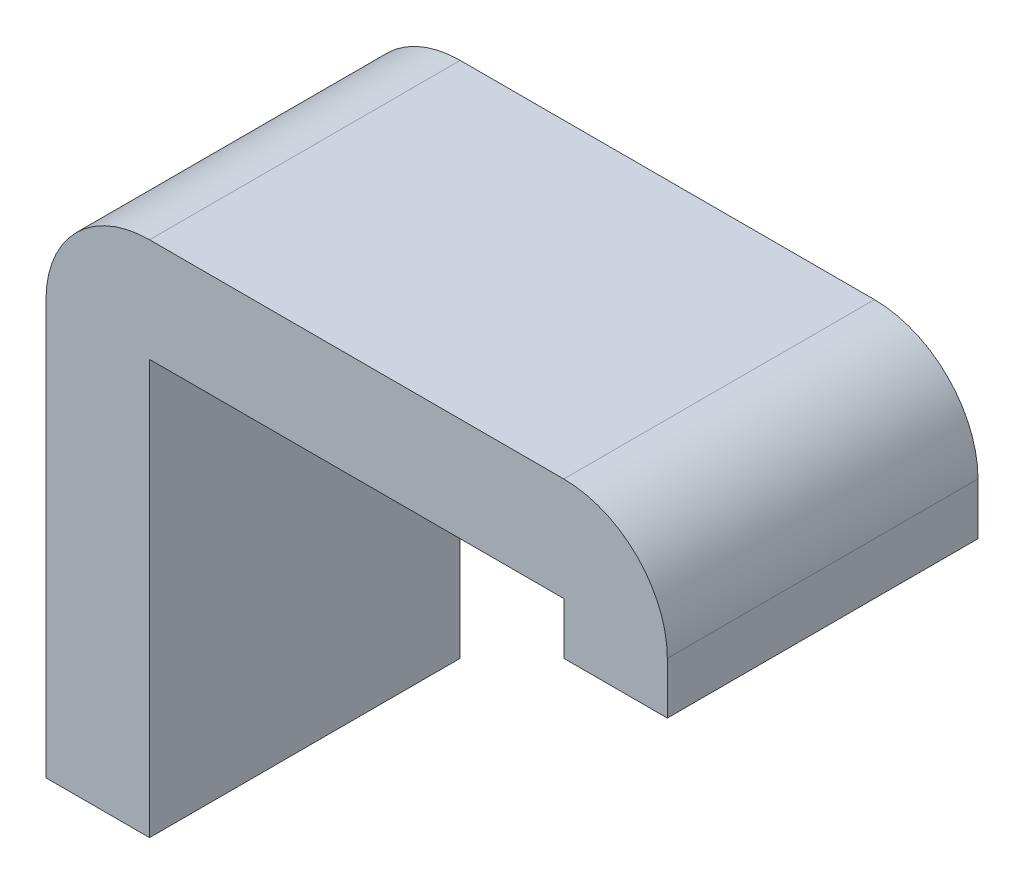
ISO-10303-21;
HEADER;
FILE_DESCRIPTION(('STEP AP214'),'2;1');
FILE_NAME('part.step','',(''),(''),'','','');
FILE_SCHEMA(('AUTOMOTIVE_DESIGN { 1 0 10303 214 1 1 1 1 }'));
ENDSEC;
DATA;
#1=APPLICATION_CONTEXT('core data for automotive mechanical design processes');
#2=APPLICATION_PROTOCOL_DEFINITION('international standard','automotive_design',2000,#1);
#3=PRODUCT_CONTEXT('',#1,'mechanical');
#4=PRODUCT('Part','Part','',(#3));
#5=PRODUCT_RELATED_PRODUCT_CATEGORY('part','',(#4));
#6=PRODUCT_DEFINITION_FORMATION('','',#4);
#7=PRODUCT_DEFINITION_CONTEXT('part definition',#1,'design');
#8=PRODUCT_DEFINITION('design','',#6,#7);
#9=PRODUCT_DEFINITION_SHAPE('','',#8);
#10=(LENGTH_UNIT() NAMED_UNIT(*) SI_UNIT(.MILLI.,.METRE.));
#11=(NAMED_UNIT(*) PLANE_ANGLE_UNIT() SI_UNIT($,.RADIAN.));
#12=(NAMED_UNIT(*) SI_UNIT($,.STERADIAN.) SOLID_ANGLE_UNIT());
#13=UNCERTAINTY_MEASURE_WITH_UNIT(LENGTH_MEASURE(1.E-05),#10,'distance_accuracy_value','');
#14=(GEOMETRIC_REPRESENTATION_CONTEXT(3) GLOBAL_UNCERTAINTY_ASSIGNED_CONTEXT((#13)) GLOBAL_UNIT_ASSIGNED_CONTEXT((#10,
#11,#12)) REPRESENTATION_CONTEXT('',''));
#15=CARTESIAN_POINT('',(0.,0.,0.));
#16=DIRECTION('',(0.,0.,1.));
#17=DIRECTION('',(1.,0.,0.));
#18=AXIS2_PLACEMENT_3D('',#15,#16,#17);
#19=CARTESIAN_POINT('',(20.,-10.0000000000001,30.));
#20=DIRECTION('',(1.,0.,0.));
#21=DIRECTION('',(0.,0.,-1.));
#22=AXIS2_PLACEMENT_3D('',#19,#20,#21);
#23=PLANE('',#22);
#24=DIRECTION('',(0.,1.,0.));
#25=VECTOR('',#24,1.);
#26=CARTESIAN_POINT('',(20.,-10.0000000000001,0.));
#27=LINE('',#26,#25);
#28=CARTESIAN_POINT('',(20.,-9.99999999999999,0.));
#29=VERTEX_POINT('',#28);
#30=CARTESIAN_POINT('',(20.,-15.,0.));
#31=VERTEX_POINT('',#30);
#32=EDGE_CURVE('E225',#29,#31,#27,.F.);
#33=ORIENTED_EDGE('',*,*,#32,.T.);
#34=DIRECTION('',(0.,0.,-1.));
#35=VECTOR('',#34,1.);
#36=CARTESIAN_POINT('',(20.,-15.,30.));
#37=LINE('',#36,#35);
#38=CARTESIAN_POINT('',(20.,-15.,30.));
#39=VERTEX_POINT('',#38);
#40=EDGE_CURVE('E11',#39,#31,#37,.T.);
#41=ORIENTED_EDGE('',*,*,#40,.F.);
#42=DIRECTION('',(0.,1.,0.));
#43=VECTOR('',#42,1.);
#44=CARTESIAN_POINT('',(20.,-10.0000000000001,30.));
#45=LINE('',#44,#43);
#46=CARTESIAN_POINT('',(20.,-9.99999999999999,30.));
#47=VERTEX_POINT('',#46);
#48=EDGE_CURVE('E231',#47,#39,#45,.F.);
#49=ORIENTED_EDGE('',*,*,#48,.F.);
#50=DIRECTION('',(0.,0.,-1.));
#51=VECTOR('',#50,1.);
#52=CARTESIAN_POINT('',(20.,-9.99999999999999,30.));
#53=LINE('',#52,#51);
#54=EDGE_CURVE('E259',#47,#29,#53,.T.);
#55=ORIENTED_EDGE('',*,*,#54,.T.);
#56=EDGE_LOOP('',(#33,#41,#49,#55));
#57=FACE_BOUND('',#56,.T.);
#58=ADVANCED_FACE('F39',(#57),#23,.F.);
#59=CARTESIAN_POINT('',(30.,-15.,30.));
#60=DIRECTION('',(0.,-1.,0.));
#61=DIRECTION('',(0.,0.,-1.));
#62=AXIS2_PLACEMENT_3D('',#59,#60,#61);
#63=PLANE('',#62);
#64=DIRECTION('',(0.,0.,-1.));
#65=VECTOR('',#64,1.);
#66=CARTESIAN_POINT('',(22.176329540257,-15.,3.08391892703518));
#67=LINE('',#66,#65);
#68=CARTESIAN_POINT('',(22.176329540257,-15.,27.2709023456088));
#69=VERTEX_POINT('',#68);
#70=CARTESIAN_POINT('',(22.176329540257,-15.,3.08391892703518));
#71=VERTEX_POINT('',#70);
#72=EDGE_CURVE('E53',#69,#71,#67,.T.);
#73=ORIENTED_EDGE('',*,*,#72,.F.);
#74=DIRECTION('',(-1.,0.,0.));
#75=VECTOR('',#74,1.);
#76=CARTESIAN_POINT('',(22.176329540257,-15.,27.2709023456088));
#77=LINE('',#76,#75);
#78=CARTESIAN_POINT('',(27.3803748723706,-15.,27.2709023456088));
#79=VERTEX_POINT('',#78);
#80=EDGE_CURVE('E182',#79,#69,#77,.T.);
#81=ORIENTED_EDGE('',*,*,#80,.F.);
#82=DIRECTION('',(0.,0.,1.));
#83=VECTOR('',#82,1.);
#84=CARTESIAN_POINT('',(27.3803748723706,-15.,27.2709023456088));
#85=LINE('',#84,#83);
#86=CARTESIAN_POINT('',(27.3803748723706,-15.,3.08391892703518));
#87=VERTEX_POINT('',#86);
#88=EDGE_CURVE('E185',#87,#79,#85,.T.);
#89=ORIENTED_EDGE('',*,*,#88,.F.);
#90=DIRECTION('',(1.,0.,0.));
#91=VECTOR('',#90,1.);
#92=CARTESIAN_POINT('',(27.3803748723706,-15.,3.08391892703518));
#93=LINE('',#92,#91);
#94=EDGE_CURVE('E191',#71,#87,#93,.T.);
#95=ORIENTED_EDGE('',*,*,#94,.F.);
#96=EDGE_LOOP('',(#73,#81,#89,#95));
#97=FACE_BOUND('',#96,.T.);
#98=DIRECTION('',(-1.,0.,0.));
#99=VECTOR('',#98,1.);
#100=CARTESIAN_POINT('',(30.,-15.,0.));
#101=LINE('',#100,#99);
#102=CARTESIAN_POINT('',(30.,-15.,0.));
#103=VERTEX_POINT('',#102);
#104=EDGE_CURVE('E262',#103,#31,#101,.T.);
#105=ORIENTED_EDGE('',*,*,#104,.F.);
#106=DIRECTION('',(0.,0.,-1.));
#107=VECTOR('',#106,1.);
#108=CARTESIAN_POINT('',(30.,-15.,30.));
#109=LINE('',#108,#107);
#110=CARTESIAN_POINT('',(30.,-15.,30.));
#111=VERTEX_POINT('',#110);
#112=EDGE_CURVE('E46',#111,#103,#109,.T.);
#113=ORIENTED_EDGE('',*,*,#112,.F.);
#114=DIRECTION('',(-1.,0.,0.));
#115=VECTOR('',#114,1.);
#116=CARTESIAN_POINT('',(30.,-15.,30.));
#117=LINE('',#116,#115);
#118=EDGE_CURVE('E233',#111,#39,#117,.T.);
#119=ORIENTED_EDGE('',*,*,#118,.T.);
#120=ORIENTED_EDGE('',*,*,#40,.T.);
#121=EDGE_LOOP('',(#105,#113,#119,#120));
#122=FACE_BOUND('',#121,.T.);
#123=ADVANCED_FACE('F309',(#97,#122),#63,.T.);
#124=CARTESIAN_POINT('',(30.,-10.0000000000001,30.));
#125=DIRECTION('',(1.,0.,0.));
#126=DIRECTION('',(0.,0.,-1.));
#127=AXIS2_PLACEMENT_3D('',#124,#125,#126);
#128=PLANE('',#127);
#129=DIRECTION('',(0.,-1.,0.));
#130=VECTOR('',#129,1.);
#131=CARTESIAN_POINT('',(30.,-10.0000000000001,0.));
#132=LINE('',#131,#130);
#133=CARTESIAN_POINT('',(30.,-10.0000000000001,0.));
#134=VERTEX_POINT('',#133);
#135=EDGE_CURVE('E265',#134,#103,#132,.T.);
#136=ORIENTED_EDGE('',*,*,#135,.F.);
#137=DIRECTION('',(0.,0.,-1.));
#138=VECTOR('',#137,1.);
#139=CARTESIAN_POINT('',(30.,-10.0000000000001,30.));
#140=LINE('',#139,#138);
#141=CARTESIAN_POINT('',(30.,-10.0000000000001,30.));
#142=VERTEX_POINT('',#141);
#143=EDGE_CURVE('E301',#142,#134,#140,.T.);
#144=ORIENTED_EDGE('',*,*,#143,.F.);
#145=DIRECTION('',(0.,-1.,0.));
#146=VECTOR('',#145,1.);
#147=CARTESIAN_POINT('',(30.,-10.0000000000001,30.));
#148=LINE('',#147,#146);
#149=EDGE_CURVE('E237',#142,#111,#148,.T.);
#150=ORIENTED_EDGE('',*,*,#149,.T.);
#151=ORIENTED_EDGE('',*,*,#112,.T.);
#152=EDGE_LOOP('',(#136,#144,#150,#151));
#153=FACE_BOUND('',#152,.T.);
#154=ADVANCED_FACE('F305',(#153),#128,.T.);
#155=CARTESIAN_POINT('',(20.,-9.99999999999999,30.));
#156=DIRECTION('',(0.,0.,-1.));
#157=DIRECTION('',(-1.,0.,0.));
#158=AXIS2_PLACEMENT_3D('',#155,#156,#157);
#159=CYLINDRICAL_SURFACE('',#158,10.);
#160=CARTESIAN_POINT('',(20.,-9.99999999999999,0.));
#161=DIRECTION('',(0.,0.,-1.));
#162=DIRECTION('',(-1.,0.,0.));
#163=AXIS2_PLACEMENT_3D('',#160,#161,#162);
#164=CIRCLE('',#163,10.);
#165=CARTESIAN_POINT('',(19.9999999999999,0.,0.));
#166=VERTEX_POINT('',#165);
#167=EDGE_CURVE('E268',#166,#134,#164,.T.);
#168=ORIENTED_EDGE('',*,*,#167,.F.);
#169=DIRECTION('',(0.,0.,-1.));
#170=VECTOR('',#169,1.);
#171=CARTESIAN_POINT('',(19.9999999999999,0.,30.));
#172=LINE('',#171,#170);
#173=CARTESIAN_POINT('',(19.9999999999999,0.,30.));
#174=VERTEX_POINT('',#173);
#175=EDGE_CURVE('E299',#174,#166,#172,.T.);
#176=ORIENTED_EDGE('',*,*,#175,.F.);
#177=CARTESIAN_POINT('',(20.,-9.99999999999999,30.));
#178=DIRECTION('',(0.,0.,-1.));
#179=DIRECTION('',(-1.,0.,0.));
#180=AXIS2_PLACEMENT_3D('',#177,#178,#179);
#181=CIRCLE('',#180,10.);
#182=EDGE_CURVE('E240',#174,#142,#181,.T.);
#183=ORIENTED_EDGE('',*,*,#182,.T.);
#184=ORIENTED_EDGE('',*,*,#143,.T.);
#185=EDGE_LOOP('',(#168,#176,#183,#184));
#186=FACE_BOUND('',#185,.T.);
#187=ADVANCED_FACE('F317',(#186),#159,.T.);
#188=CARTESIAN_POINT('',(-19.9999999999999,0.,30.));
#189=DIRECTION('',(0.,1.,0.));
#190=DIRECTION('',(-1.,0.,0.));
#191=AXIS2_PLACEMENT_3D('',#188,#189,#190);
#192=PLANE('',#191);
#193=DIRECTION('',(1.,0.,0.));
#194=VECTOR('',#193,1.);
#195=CARTESIAN_POINT('',(-19.9999999999999,0.,0.));
#196=LINE('',#195,#194);
#197=CARTESIAN_POINT('',(-19.9999999999999,0.,0.));
#198=VERTEX_POINT('',#197);
#199=EDGE_CURVE('E271',#198,#166,#196,.T.);
#200=ORIENTED_EDGE('',*,*,#199,.F.);
#201=DIRECTION('',(0.,0.,-1.));
#202=VECTOR('',#201,1.);
#203=CARTESIAN_POINT('',(-19.9999999999999,0.,30.));
#204=LINE('',#203,#202);
#205=CARTESIAN_POINT('',(-19.9999999999999,0.,30.));
#206=VERTEX_POINT('',#205);
#207=EDGE_CURVE('E297',#206,#198,#204,.T.);
#208=ORIENTED_EDGE('',*,*,#207,.F.);
#209=DIRECTION('',(1.,0.,0.));
#210=VECTOR('',#209,1.);
#211=CARTESIAN_POINT('',(-19.9999999999999,0.,30.));
#212=LINE('',#211,#210);
#213=EDGE_CURVE('E243',#206,#174,#212,.T.);
#214=ORIENTED_EDGE('',*,*,#213,.T.);
#215=ORIENTED_EDGE('',*,*,#175,.T.);
#216=EDGE_LOOP('',(#200,#208,#214,#215));
#217=FACE_BOUND('',#216,.T.);
#218=ADVANCED_FACE('F347',(#217),#192,.T.);
#219=CARTESIAN_POINT('',(-20.,-10.,30.));
#220=DIRECTION('',(0.,0.,-1.));
#221=DIRECTION('',(-1.,0.,0.));
#222=AXIS2_PLACEMENT_3D('',#219,#220,#221);
#223=CYLINDRICAL_SURFACE('',#222,10.);
#224=CARTESIAN_POINT('',(-20.,-10.,0.));
#225=DIRECTION('',(0.,0.,-1.));
#226=DIRECTION('',(1.,0.,0.));
#227=AXIS2_PLACEMENT_3D('',#224,#225,#226);
#228=CIRCLE('',#227,10.);
#229=CARTESIAN_POINT('',(-30.,-10.0000000000001,0.));
#230=VERTEX_POINT('',#229);
#231=EDGE_CURVE('E274',#230,#198,#228,.T.);
#232=ORIENTED_EDGE('',*,*,#231,.F.);
#233=DIRECTION('',(0.,0.,-1.));
#234=VECTOR('',#233,1.);
#235=CARTESIAN_POINT('',(-30.,-10.0000000000001,30.));
#236=LINE('',#235,#234);
#237=CARTESIAN_POINT('',(-30.,-10.0000000000001,30.));
#238=VERTEX_POINT('',#237);
#239=EDGE_CURVE('E295',#238,#230,#236,.T.);
#240=ORIENTED_EDGE('',*,*,#239,.F.);
#241=CARTESIAN_POINT('',(-20.,-10.,30.));
#242=DIRECTION('',(0.,0.,-1.));
#243=DIRECTION('',(1.,0.,0.));
#244=AXIS2_PLACEMENT_3D('',#241,#242,#243);
#245=CIRCLE('',#244,10.);
#246=EDGE_CURVE('E246',#238,#206,#245,.T.);
#247=ORIENTED_EDGE('',*,*,#246,.T.);
#248=ORIENTED_EDGE('',*,*,#207,.T.);
#249=EDGE_LOOP('',(#232,#240,#247,#248));
#250=FACE_BOUND('',#249,.T.);
#251=ADVANCED_FACE('F345',(#250),#223,.T.);
#252=CARTESIAN_POINT('',(-30.,-10.0000000000001,30.));
#253=DIRECTION('',(-1.,0.,0.));
#254=DIRECTION('',(0.,-1.,0.));
#255=AXIS2_PLACEMENT_3D('',#252,#253,#254);
#256=PLANE('',#255);
#257=DIRECTION('',(0.,1.,0.));
#258=VECTOR('',#257,1.);
#259=CARTESIAN_POINT('',(-30.,-10.0000000000001,0.));
#260=LINE('',#259,#258);
#261=CARTESIAN_POINT('',(-30.,-50.,0.));
#262=VERTEX_POINT('',#261);
#263=EDGE_CURVE('E277',#262,#230,#260,.T.);
#264=ORIENTED_EDGE('',*,*,#263,.F.);
#265=DIRECTION('',(0.,0.,-1.));
#266=VECTOR('',#265,1.);
#267=CARTESIAN_POINT('',(-30.,-50.,30.));
#268=LINE('',#267,#266);
#269=CARTESIAN_POINT('',(-30.,-50.,30.));
#270=VERTEX_POINT('',#269);
#271=EDGE_CURVE('E293',#270,#262,#268,.T.);
#272=ORIENTED_EDGE('',*,*,#271,.F.);
#273=DIRECTION('',(0.,1.,0.));
#274=VECTOR('',#273,1.);
#275=CARTESIAN_POINT('',(-30.,-10.0000000000001,30.));
#276=LINE('',#275,#274);
#277=EDGE_CURVE('E249',#270,#238,#276,.T.);
#278=ORIENTED_EDGE('',*,*,#277,.T.);
#279=ORIENTED_EDGE('',*,*,#239,.T.);
#280=EDGE_LOOP('',(#264,#272,#278,#279));
#281=FACE_BOUND('',#280,.T.);
#282=ADVANCED_FACE('F341',(#281),#256,.T.);
#283=CARTESIAN_POINT('',(-20.,-50.,30.));
#284=DIRECTION('',(0.,-1.,0.));
#285=DIRECTION('',(0.,0.,-1.));
#286=AXIS2_PLACEMENT_3D('',#283,#284,#285);
#287=PLANE('',#286);
#288=DIRECTION('',(0.,0.,-1.));
#289=VECTOR('',#288,1.);
#290=CARTESIAN_POINT('',(-28.3265649327549,-50.,2.31513950297319));
#291=LINE('',#290,#289);
#292=CARTESIAN_POINT('',(-28.3265649327549,-50.,28.1579555272193));
#293=VERTEX_POINT('',#292);
#294=CARTESIAN_POINT('',(-28.3265649327549,-50.,2.31513950297318));
#295=VERTEX_POINT('',#294);
#296=EDGE_CURVE('E61',#293,#295,#291,.T.);
#297=ORIENTED_EDGE('',*,*,#296,.F.);
#298=DIRECTION('',(-1.,0.,0.));
#299=VECTOR('',#298,1.);
#300=CARTESIAN_POINT('',(-28.3265649327549,-50.,28.1579555272193));
#301=LINE('',#300,#299);
#302=CARTESIAN_POINT('',(-21.9397820251609,-50.,28.1579555272193));
#303=VERTEX_POINT('',#302);
#304=EDGE_CURVE('E204',#303,#293,#301,.T.);
#305=ORIENTED_EDGE('',*,*,#304,.F.);
#306=DIRECTION('',(0.,0.,1.));
#307=VECTOR('',#306,1.);
#308=CARTESIAN_POINT('',(-21.9397820251609,-50.,28.1579555272193));
#309=LINE('',#308,#307);
#310=CARTESIAN_POINT('',(-21.9397820251609,-50.,2.31513950297319));
#311=VERTEX_POINT('',#310);
#312=EDGE_CURVE('E218',#311,#303,#309,.T.);
#313=ORIENTED_EDGE('',*,*,#312,.F.);
#314=DIRECTION('',(1.,0.,0.));
#315=VECTOR('',#314,1.);
#316=CARTESIAN_POINT('',(-21.9397820251609,-50.,2.31513950297319));
#317=LINE('',#316,#315);
#318=EDGE_CURVE('E215',#295,#311,#317,.T.);
#319=ORIENTED_EDGE('',*,*,#318,.F.);
#320=EDGE_LOOP('',(#297,#305,#313,#319));
#321=FACE_BOUND('',#320,.T.);
#322=DIRECTION('',(-1.,0.,0.));
#323=VECTOR('',#322,1.);
#324=CARTESIAN_POINT('',(-20.,-50.,0.));
#325=LINE('',#324,#323);
#326=CARTESIAN_POINT('',(-20.,-50.,0.));
#327=VERTEX_POINT('',#326);
#328=EDGE_CURVE('E280',#327,#262,#325,.T.);
#329=ORIENTED_EDGE('',*,*,#328,.F.);
#330=DIRECTION('',(0.,0.,-1.));
#331=VECTOR('',#330,1.);
#332=CARTESIAN_POINT('',(-20.,-50.,30.));
#333=LINE('',#332,#331);
#334=CARTESIAN_POINT('',(-20.,-50.,30.));
#335=VERTEX_POINT('',#334);
#336=EDGE_CURVE('E291',#335,#327,#333,.T.);
#337=ORIENTED_EDGE('',*,*,#336,.F.);
#338=DIRECTION('',(-1.,0.,0.));
#339=VECTOR('',#338,1.);
#340=CARTESIAN_POINT('',(-20.,-50.,30.));
#341=LINE('',#340,#339);
#342=EDGE_CURVE('E252',#335,#270,#341,.T.);
#343=ORIENTED_EDGE('',*,*,#342,.T.);
#344=ORIENTED_EDGE('',*,*,#271,.T.);
#345=EDGE_LOOP('',(#329,#337,#343,#344));
#346=FACE_BOUND('',#345,.T.);
#347=ADVANCED_FACE('F337',(#321,#346),#287,.T.);
#348=CARTESIAN_POINT('',(-20.,-10.0000000000001,30.));
#349=DIRECTION('',(-1.,0.,0.));
#350=DIRECTION('',(0.,-1.,0.));
#351=AXIS2_PLACEMENT_3D('',#348,#349,#350);
#352=PLANE('',#351);
#353=DIRECTION('',(0.,1.,0.));
#354=VECTOR('',#353,1.);
#355=CARTESIAN_POINT('',(-20.,-10.0000000000001,0.));
#356=LINE('',#355,#354);
#357=CARTESIAN_POINT('',(-20.,-10.,0.));
#358=VERTEX_POINT('',#357);
#359=EDGE_CURVE('E283',#327,#358,#356,.T.);
#360=ORIENTED_EDGE('',*,*,#359,.T.);
#361=DIRECTION('',(0.,0.,-1.));
#362=VECTOR('',#361,1.);
#363=CARTESIAN_POINT('',(-20.,-10.,30.));
#364=LINE('',#363,#362);
#365=CARTESIAN_POINT('',(-20.,-10.,30.));
#366=VERTEX_POINT('',#365);
#367=EDGE_CURVE('E288',#366,#358,#364,.T.);
#368=ORIENTED_EDGE('',*,*,#367,.F.);
#369=DIRECTION('',(0.,1.,0.));
#370=VECTOR('',#369,1.);
#371=CARTESIAN_POINT('',(-20.,-10.0000000000001,30.));
#372=LINE('',#371,#370);
#373=EDGE_CURVE('E255',#335,#366,#372,.T.);
#374=ORIENTED_EDGE('',*,*,#373,.F.);
#375=ORIENTED_EDGE('',*,*,#336,.T.);
#376=EDGE_LOOP('',(#360,#368,#374,#375));
#377=FACE_BOUND('',#376,.T.);
#378=ADVANCED_FACE('F334',(#377),#352,.F.);
#379=CARTESIAN_POINT('',(-19.9999999999999,-10.,30.));
#380=DIRECTION('',(0.,1.,0.));
#381=DIRECTION('',(-1.,0.,0.));
#382=AXIS2_PLACEMENT_3D('',#379,#380,#381);
#383=PLANE('',#382);
#384=DIRECTION('',(1.,0.,0.));
#385=VECTOR('',#384,1.);
#386=CARTESIAN_POINT('',(-19.9999999999999,-10.,0.));
#387=LINE('',#386,#385);
#388=EDGE_CURVE('E234',#358,#29,#387,.T.);
#389=ORIENTED_EDGE('',*,*,#388,.T.);
#390=ORIENTED_EDGE('',*,*,#54,.F.);
#391=DIRECTION('',(1.,0.,0.));
#392=VECTOR('',#391,1.);
#393=CARTESIAN_POINT('',(-19.9999999999999,-10.,30.));
#394=LINE('',#393,#392);
#395=EDGE_CURVE('E257',#366,#47,#394,.T.);
#396=ORIENTED_EDGE('',*,*,#395,.F.);
#397=ORIENTED_EDGE('',*,*,#367,.T.);
#398=EDGE_LOOP('',(#389,#390,#396,#397));
#399=FACE_BOUND('',#398,.T.);
#400=ADVANCED_FACE('F330',(#399),#383,.F.);
#401=CARTESIAN_POINT('',(20.,-9.99999999999999,30.));
#402=DIRECTION('',(0.,0.,-1.));
#403=DIRECTION('',(-1.,0.,0.));
#404=AXIS2_PLACEMENT_3D('',#401,#402,#403);
#405=PLANE('',#404);
#406=ORIENTED_EDGE('',*,*,#48,.T.);
#407=ORIENTED_EDGE('',*,*,#118,.F.);
#408=ORIENTED_EDGE('',*,*,#149,.F.);
#409=ORIENTED_EDGE('',*,*,#182,.F.);
#410=ORIENTED_EDGE('',*,*,#213,.F.);
#411=ORIENTED_EDGE('',*,*,#246,.F.);
#412=ORIENTED_EDGE('',*,*,#277,.F.);
#413=ORIENTED_EDGE('',*,*,#342,.F.);
#414=ORIENTED_EDGE('',*,*,#373,.T.);
#415=ORIENTED_EDGE('',*,*,#395,.T.);
#416=EDGE_LOOP('',(#406,#407,#408,#409,#410,#411,#412,#413,#414,#415));
#417=FACE_BOUND('',#416,.T.);
#418=ADVANCED_FACE('F320',(#417),#405,.F.);
#419=CARTESIAN_POINT('',(20.,-9.99999999999999,0.));
#420=DIRECTION('',(0.,0.,-1.));
#421=DIRECTION('',(-1.,0.,0.));
#422=AXIS2_PLACEMENT_3D('',#419,#420,#421);
#423=PLANE('',#422);
#424=ORIENTED_EDGE('',*,*,#32,.F.);
#425=ORIENTED_EDGE('',*,*,#388,.F.);
#426=ORIENTED_EDGE('',*,*,#359,.F.);
#427=ORIENTED_EDGE('',*,*,#328,.T.);
#428=ORIENTED_EDGE('',*,*,#263,.T.);
#429=ORIENTED_EDGE('',*,*,#231,.T.);
#430=ORIENTED_EDGE('',*,*,#199,.T.);
#431=ORIENTED_EDGE('',*,*,#167,.T.);
#432=ORIENTED_EDGE('',*,*,#135,.T.);
#433=ORIENTED_EDGE('',*,*,#104,.T.);
#434=EDGE_LOOP('',(#424,#425,#426,#427,#428,#429,#430,#431,#432,#433));
#435=FACE_BOUND('',#434,.T.);
#436=ADVANCED_FACE('F313',(#435),#423,.T.);
#437=CARTESIAN_POINT('',(-28.3265649327549,-10.,2.31513950297319));
#438=DIRECTION('',(-1.,0.,0.));
#439=DIRECTION('',(0.,0.,1.));
#440=AXIS2_PLACEMENT_3D('',#437,#438,#439);
#441=PLANE('',#440);
#442=ORIENTED_EDGE('',*,*,#296,.T.);
#443=DIRECTION('',(0.,-1.,0.));
#444=VECTOR('',#443,1.);
#445=CARTESIAN_POINT('',(-28.3265649327549,-10.,2.31513950297319));
#446=LINE('',#445,#444);
#447=CARTESIAN_POINT('',(-28.3265649327549,-10.,2.31513950297319));
#448=VERTEX_POINT('',#447);
#449=EDGE_CURVE('E213',#448,#295,#446,.T.);
#450=ORIENTED_EDGE('',*,*,#449,.F.);
#451=DIRECTION('',(0.,0.,-1.));
#452=VECTOR('',#451,1.);
#453=CARTESIAN_POINT('',(-28.3265649327549,-10.,2.31513950297319));
#454=LINE('',#453,#452);
#455=CARTESIAN_POINT('',(-28.3265649327549,-10.,28.1579555272193));
#456=VERTEX_POINT('',#455);
#457=EDGE_CURVE('E200',#456,#448,#454,.T.);
#458=ORIENTED_EDGE('',*,*,#457,.F.);
#459=DIRECTION('',(0.,-1.,0.));
#460=VECTOR('',#459,1.);
#461=CARTESIAN_POINT('',(-28.3265649327549,-10.,28.1579555272193));
#462=LINE('',#461,#460);
#463=EDGE_CURVE('E223',#456,#293,#462,.T.);
#464=ORIENTED_EDGE('',*,*,#463,.T.);
#465=EDGE_LOOP('',(#442,#450,#458,#464));
#466=FACE_BOUND('',#465,.T.);
#467=ADVANCED_FACE('F392',(#466),#441,.F.);
#468=CARTESIAN_POINT('',(-28.3265649327549,-10.,28.1579555272193));
#469=DIRECTION('',(0.,0.,1.));
#470=DIRECTION('',(1.,0.,0.));
#471=AXIS2_PLACEMENT_3D('',#468,#469,#470);
#472=PLANE('',#471);
#473=ORIENTED_EDGE('',*,*,#304,.T.);
#474=ORIENTED_EDGE('',*,*,#463,.F.);
#475=DIRECTION('',(-1.,0.,0.));
#476=VECTOR('',#475,1.);
#477=CARTESIAN_POINT('',(-28.3265649327549,-10.,28.1579555272193));
#478=LINE('',#477,#476);
#479=CARTESIAN_POINT('',(-21.9397820251609,-10.,28.1579555272193));
#480=VERTEX_POINT('',#479);
#481=EDGE_CURVE('E210',#480,#456,#478,.T.);
#482=ORIENTED_EDGE('',*,*,#481,.F.);
#483=DIRECTION('',(0.,-1.,0.));
#484=VECTOR('',#483,1.);
#485=CARTESIAN_POINT('',(-21.9397820251609,-10.,28.1579555272193));
#486=LINE('',#485,#484);
#487=EDGE_CURVE('E226',#480,#303,#486,.T.);
#488=ORIENTED_EDGE('',*,*,#487,.T.);
#489=EDGE_LOOP('',(#473,#474,#482,#488));
#490=FACE_BOUND('',#489,.T.);
#491=ADVANCED_FACE('F388',(#490),#472,.F.);
#492=CARTESIAN_POINT('',(-21.9397820251609,-10.,28.1579555272193));
#493=DIRECTION('',(1.,0.,0.));
#494=DIRECTION('',(0.,0.,-1.));
#495=AXIS2_PLACEMENT_3D('',#492,#493,#494);
#496=PLANE('',#495);
#497=ORIENTED_EDGE('',*,*,#312,.T.);
#498=ORIENTED_EDGE('',*,*,#487,.F.);
#499=DIRECTION('',(0.,0.,1.));
#500=VECTOR('',#499,1.);
#501=CARTESIAN_POINT('',(-21.9397820251609,-10.,28.1579555272193));
#502=LINE('',#501,#500);
#503=CARTESIAN_POINT('',(-21.9397820251609,-10.,2.31513950297319));
#504=VERTEX_POINT('',#503);
#505=EDGE_CURVE('E207',#504,#480,#502,.T.);
#506=ORIENTED_EDGE('',*,*,#505,.F.);
#507=DIRECTION('',(0.,-1.,0.));
#508=VECTOR('',#507,1.);
#509=CARTESIAN_POINT('',(-21.9397820251609,-10.,2.31513950297319));
#510=LINE('',#509,#508);
#511=EDGE_CURVE('E228',#504,#311,#510,.T.);
#512=ORIENTED_EDGE('',*,*,#511,.T.);
#513=EDGE_LOOP('',(#497,#498,#506,#512));
#514=FACE_BOUND('',#513,.T.);
#515=ADVANCED_FACE('F391',(#514),#496,.F.);
#516=CARTESIAN_POINT('',(-21.9397820251609,-10.,2.31513950297319));
#517=DIRECTION('',(0.,0.,-1.));
#518=DIRECTION('',(-1.,0.,0.));
#519=AXIS2_PLACEMENT_3D('',#516,#517,#518);
#520=PLANE('',#519);
#521=ORIENTED_EDGE('',*,*,#318,.T.);
#522=ORIENTED_EDGE('',*,*,#511,.F.);
#523=DIRECTION('',(1.,0.,0.));
#524=VECTOR('',#523,1.);
#525=CARTESIAN_POINT('',(-21.9397820251609,-10.,2.31513950297319));
#526=LINE('',#525,#524);
#527=EDGE_CURVE('E203',#448,#504,#526,.T.);
#528=ORIENTED_EDGE('',*,*,#527,.F.);
#529=ORIENTED_EDGE('',*,*,#449,.T.);
#530=EDGE_LOOP('',(#521,#522,#528,#529));
#531=FACE_BOUND('',#530,.T.);
#532=ADVANCED_FACE('F386',(#531),#520,.F.);
#533=CARTESIAN_POINT('',(0.,-10.,0.));
#534=DIRECTION('',(0.,1.,0.));
#535=DIRECTION('',(0.,0.,1.));
#536=AXIS2_PLACEMENT_3D('',#533,#534,#535);
#537=PLANE('',#536);
#538=ORIENTED_EDGE('',*,*,#457,.T.);
#539=ORIENTED_EDGE('',*,*,#527,.T.);
#540=ORIENTED_EDGE('',*,*,#505,.T.);
#541=ORIENTED_EDGE('',*,*,#481,.T.);
#542=EDGE_LOOP('',(#538,#539,#540,#541));
#543=FACE_BOUND('',#542,.T.);
#544=ADVANCED_FACE('F378',(#543),#537,.F.);
#545=CARTESIAN_POINT('',(22.176329540257,-4.99999999999999,3.08391892703518));
#546=DIRECTION('',(-1.,0.,0.));
#547=DIRECTION('',(0.,0.,1.));
#548=AXIS2_PLACEMENT_3D('',#545,#546,#547);
#549=PLANE('',#548);
#550=ORIENTED_EDGE('',*,*,#72,.T.);
#551=DIRECTION('',(0.,-1.,0.));
#552=VECTOR('',#551,1.);
#553=CARTESIAN_POINT('',(22.176329540257,-4.99999999999999,3.08391892703518));
#554=LINE('',#553,#552);
#555=CARTESIAN_POINT('',(22.176329540257,-4.99999999999999,3.08391892703518));
#556=VERTEX_POINT('',#555);
#557=EDGE_CURVE('E160',#556,#71,#554,.T.);
#558=ORIENTED_EDGE('',*,*,#557,.F.);
#559=DIRECTION('',(0.,0.,-1.));
#560=VECTOR('',#559,1.);
#561=CARTESIAN_POINT('',(22.176329540257,-4.99999999999999,3.08391892703518));
#562=LINE('',#561,#560);
#563=CARTESIAN_POINT('',(22.176329540257,-4.99999999999999,27.2709023456088));
#564=VERTEX_POINT('',#563);
#565=EDGE_CURVE('E164',#564,#556,#562,.T.);
#566=ORIENTED_EDGE('',*,*,#565,.F.);
#567=DIRECTION('',(0.,-1.,0.));
#568=VECTOR('',#567,1.);
#569=CARTESIAN_POINT('',(22.176329540257,-4.99999999999999,27.2709023456088));
#570=LINE('',#569,#568);
#571=EDGE_CURVE('E195',#564,#69,#570,.T.);
#572=ORIENTED_EDGE('',*,*,#571,.T.);
#573=EDGE_LOOP('',(#550,#558,#566,#572));
#574=FACE_BOUND('',#573,.T.);
#575=ADVANCED_FACE('F162',(#574),#549,.F.);
#576=CARTESIAN_POINT('',(22.176329540257,-4.99999999999999,27.2709023456088));
#577=DIRECTION('',(0.,0.,1.));
#578=DIRECTION('',(1.,0.,0.));
#579=AXIS2_PLACEMENT_3D('',#576,#577,#578);
#580=PLANE('',#579);
#581=ORIENTED_EDGE('',*,*,#80,.T.);
#582=ORIENTED_EDGE('',*,*,#571,.F.);
#583=DIRECTION('',(-1.,0.,0.));
#584=VECTOR('',#583,1.);
#585=CARTESIAN_POINT('',(22.176329540257,-4.99999999999999,27.2709023456088));
#586=LINE('',#585,#584);
#587=CARTESIAN_POINT('',(27.3803748723706,-4.99999999999999,27.2709023456088));
#588=VERTEX_POINT('',#587);
#589=EDGE_CURVE('E170',#588,#564,#586,.T.);
#590=ORIENTED_EDGE('',*,*,#589,.F.);
#591=DIRECTION('',(0.,-1.,0.));
#592=VECTOR('',#591,1.);
#593=CARTESIAN_POINT('',(27.3803748723706,-4.99999999999999,27.2709023456088));
#594=LINE('',#593,#592);
#595=EDGE_CURVE('E197',#588,#79,#594,.T.);
#596=ORIENTED_EDGE('',*,*,#595,.T.);
#597=EDGE_LOOP('',(#581,#582,#590,#596));
#598=FACE_BOUND('',#597,.T.);
#599=ADVANCED_FACE('F370',(#598),#580,.F.);
#600=CARTESIAN_POINT('',(27.3803748723706,-4.99999999999999,27.2709023456088));
#601=DIRECTION('',(1.,0.,0.));
#602=DIRECTION('',(0.,0.,-1.));
#603=AXIS2_PLACEMENT_3D('',#600,#601,#602);
#604=PLANE('',#603);
#605=ORIENTED_EDGE('',*,*,#88,.T.);
#606=ORIENTED_EDGE('',*,*,#595,.F.);
#607=DIRECTION('',(0.,0.,1.));
#608=VECTOR('',#607,1.);
#609=CARTESIAN_POINT('',(27.3803748723706,-4.99999999999999,27.2709023456088));
#610=LINE('',#609,#608);
#611=CARTESIAN_POINT('',(27.3803748723706,-4.99999999999999,3.08391892703518));
#612=VERTEX_POINT('',#611);
#613=EDGE_CURVE('E178',#612,#588,#610,.T.);
#614=ORIENTED_EDGE('',*,*,#613,.F.);
#615=DIRECTION('',(0.,-1.,0.));
#616=VECTOR('',#615,1.);
#617=CARTESIAN_POINT('',(27.3803748723706,-4.99999999999999,3.08391892703518));
#618=LINE('',#617,#616);
#619=EDGE_CURVE('E169',#612,#87,#618,.T.);
#620=ORIENTED_EDGE('',*,*,#619,.T.);
#621=EDGE_LOOP('',(#605,#606,#614,#620));
#622=FACE_BOUND('',#621,.T.);
#623=ADVANCED_FACE('F368',(#622),#604,.F.);
#624=CARTESIAN_POINT('',(27.3803748723706,-4.99999999999999,3.08391892703518));
#625=DIRECTION('',(0.,0.,-1.));
#626=DIRECTION('',(-1.,0.,0.));
#627=AXIS2_PLACEMENT_3D('',#624,#625,#626);
#628=PLANE('',#627);
#629=ORIENTED_EDGE('',*,*,#94,.T.);
#630=ORIENTED_EDGE('',*,*,#619,.F.);
#631=DIRECTION('',(1.,0.,0.));
#632=VECTOR('',#631,1.);
#633=CARTESIAN_POINT('',(27.3803748723706,-4.99999999999999,3.08391892703518));
#634=LINE('',#633,#632);
#635=EDGE_CURVE('E173',#556,#612,#634,.T.);
#636=ORIENTED_EDGE('',*,*,#635,.F.);
#637=ORIENTED_EDGE('',*,*,#557,.T.);
#638=EDGE_LOOP('',(#629,#630,#636,#637));
#639=FACE_BOUND('',#638,.T.);
#640=ADVANCED_FACE('F174',(#639),#628,.F.);
#641=CARTESIAN_POINT('',(0.,-4.99999999999999,0.));
#642=DIRECTION('',(0.,1.,0.));
#643=DIRECTION('',(0.,0.,1.));
#644=AXIS2_PLACEMENT_3D('',#641,#642,#643);
#645=PLANE('',#644);
#646=ORIENTED_EDGE('',*,*,#565,.T.);
#647=ORIENTED_EDGE('',*,*,#635,.T.);
#648=ORIENTED_EDGE('',*,*,#613,.T.);
#649=ORIENTED_EDGE('',*,*,#589,.T.);
#650=EDGE_LOOP('',(#646,#647,#648,#649));
#651=FACE_BOUND('',#650,.T.);
#652=ADVANCED_FACE('F180',(#651),#645,.F.);
#653=CLOSED_SHELL('',(#58,#123,#154,#187,#218,#251,#282,#347,#378,#400,#418,#436,#467,#491,#515,
#532,#544,#575,#599,#623,#640,#652));
#654=MANIFOLD_SOLID_BREP('B2',#653);
#655=ADVANCED_BREP_SHAPE_REPRESENTATION('',(#18,#654),#14);
#656=SHAPE_DEFINITION_REPRESENTATION(#9,#655);
ENDSEC;
END-ISO-10303-21;
